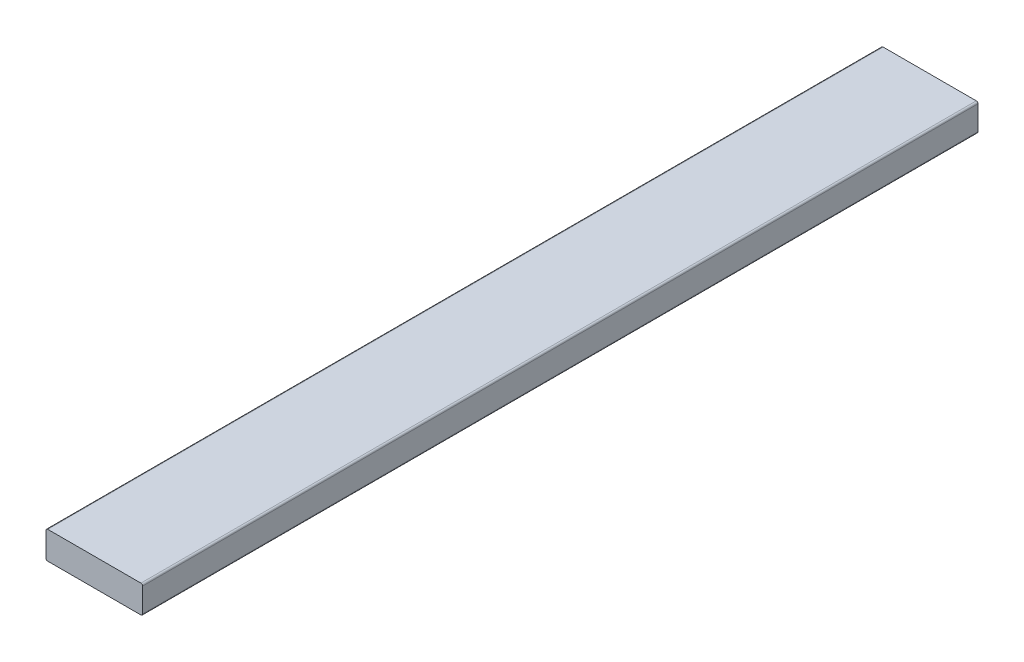
ISO-10303-21;
HEADER;
FILE_DESCRIPTION(('STEP AP214'),'2;1');
FILE_NAME('part.step','',(''),(''),'','','');
FILE_SCHEMA(('AUTOMOTIVE_DESIGN { 1 0 10303 214 1 1 1 1 }'));
ENDSEC;
DATA;
#1=APPLICATION_CONTEXT('core data for automotive mechanical design processes');
#2=APPLICATION_PROTOCOL_DEFINITION('international standard','automotive_design',2000,#1);
#3=PRODUCT_CONTEXT('',#1,'mechanical');
#4=PRODUCT('Part','Part','',(#3));
#5=PRODUCT_RELATED_PRODUCT_CATEGORY('part','',(#4));
#6=PRODUCT_DEFINITION_FORMATION('','',#4);
#7=PRODUCT_DEFINITION_CONTEXT('part definition',#1,'design');
#8=PRODUCT_DEFINITION('design','',#6,#7);
#9=PRODUCT_DEFINITION_SHAPE('','',#8);
#10=(LENGTH_UNIT() NAMED_UNIT(*) SI_UNIT(.MILLI.,.METRE.));
#11=(NAMED_UNIT(*) PLANE_ANGLE_UNIT() SI_UNIT($,.RADIAN.));
#12=(NAMED_UNIT(*) SI_UNIT($,.STERADIAN.) SOLID_ANGLE_UNIT());
#13=UNCERTAINTY_MEASURE_WITH_UNIT(LENGTH_MEASURE(1.E-05),#10,'distance_accuracy_value','');
#14=(GEOMETRIC_REPRESENTATION_CONTEXT(3) GLOBAL_UNCERTAINTY_ASSIGNED_CONTEXT((#13)) GLOBAL_UNIT_ASSIGNED_CONTEXT((#10,
#11,#12)) REPRESENTATION_CONTEXT('',''));
#15=CARTESIAN_POINT('',(0.,0.,0.));
#16=DIRECTION('',(0.,0.,1.));
#17=DIRECTION('',(1.,0.,0.));
#18=AXIS2_PLACEMENT_3D('',#15,#16,#17);
#19=CARTESIAN_POINT('',(44.45,-12.7,768.35));
#20=DIRECTION('',(-1.,0.,0.));
#21=DIRECTION('',(0.,0.,1.));
#22=AXIS2_PLACEMENT_3D('',#19,#20,#21);
#23=PLANE('',#22);
#24=DIRECTION('',(0.,1.,0.));
#25=VECTOR('',#24,1.);
#26=CARTESIAN_POINT('',(44.45,-12.7,768.35));
#27=LINE('',#26,#25);
#28=CARTESIAN_POINT('',(44.45,-11.1125,768.35));
#29=VERTEX_POINT('',#28);
#30=CARTESIAN_POINT('',(44.45,11.1125,768.35));
#31=VERTEX_POINT('',#30);
#32=EDGE_CURVE('E126',#29,#31,#27,.T.);
#33=ORIENTED_EDGE('',*,*,#32,.F.);
#34=DIRECTION('',(0.,0.,-1.));
#35=VECTOR('',#34,1.);
#36=CARTESIAN_POINT('',(44.45,-11.1125,768.35));
#37=LINE('',#36,#35);
#38=CARTESIAN_POINT('',(44.45,-11.1125,0.));
#39=VERTEX_POINT('',#38);
#40=EDGE_CURVE('E152',#29,#39,#37,.T.);
#41=ORIENTED_EDGE('',*,*,#40,.T.);
#42=DIRECTION('',(0.,1.,0.));
#43=VECTOR('',#42,1.);
#44=CARTESIAN_POINT('',(44.45,-12.7,0.));
#45=LINE('',#44,#43);
#46=CARTESIAN_POINT('',(44.45,11.1125,0.));
#47=VERTEX_POINT('',#46);
#48=EDGE_CURVE('E160',#39,#47,#45,.T.);
#49=ORIENTED_EDGE('',*,*,#48,.T.);
#50=DIRECTION('',(0.,0.,-1.));
#51=VECTOR('',#50,1.);
#52=CARTESIAN_POINT('',(44.45,11.1125,768.35));
#53=LINE('',#52,#51);
#54=EDGE_CURVE('E150',#47,#31,#53,.F.);
#55=ORIENTED_EDGE('',*,*,#54,.T.);
#56=EDGE_LOOP('',(#33,#41,#49,#55));
#57=FACE_BOUND('',#56,.T.);
#58=ADVANCED_FACE('F35',(#57),#23,.F.);
#59=CARTESIAN_POINT('',(-44.45,12.7,768.35));
#60=DIRECTION('',(0.,-1.,0.));
#61=DIRECTION('',(0.,0.,-1.));
#62=AXIS2_PLACEMENT_3D('',#59,#60,#61);
#63=PLANE('',#62);
#64=DIRECTION('',(-1.,0.,0.));
#65=VECTOR('',#64,1.);
#66=CARTESIAN_POINT('',(-44.45,12.7,0.));
#67=LINE('',#66,#65);
#68=CARTESIAN_POINT('',(42.8625,12.7,0.));
#69=VERTEX_POINT('',#68);
#70=CARTESIAN_POINT('',(-42.8625,12.7,0.));
#71=VERTEX_POINT('',#70);
#72=EDGE_CURVE('E131',#69,#71,#67,.T.);
#73=ORIENTED_EDGE('',*,*,#72,.T.);
#74=DIRECTION('',(0.,0.,-1.));
#75=VECTOR('',#74,1.);
#76=CARTESIAN_POINT('',(-42.8625,12.7,768.35));
#77=LINE('',#76,#75);
#78=CARTESIAN_POINT('',(-42.8625,12.7,768.35));
#79=VERTEX_POINT('',#78);
#80=EDGE_CURVE('E11',#71,#79,#77,.F.);
#81=ORIENTED_EDGE('',*,*,#80,.T.);
#82=DIRECTION('',(-1.,0.,0.));
#83=VECTOR('',#82,1.);
#84=CARTESIAN_POINT('',(-44.45,12.7,768.35));
#85=LINE('',#84,#83);
#86=CARTESIAN_POINT('',(42.8625,12.7,768.35));
#87=VERTEX_POINT('',#86);
#88=EDGE_CURVE('E129',#87,#79,#85,.T.);
#89=ORIENTED_EDGE('',*,*,#88,.F.);
#90=DIRECTION('',(0.,0.,-1.));
#91=VECTOR('',#90,1.);
#92=CARTESIAN_POINT('',(42.8625,12.7,768.35));
#93=LINE('',#92,#91);
#94=EDGE_CURVE('E43',#87,#69,#93,.T.);
#95=ORIENTED_EDGE('',*,*,#94,.T.);
#96=EDGE_LOOP('',(#73,#81,#89,#95));
#97=FACE_BOUND('',#96,.T.);
#98=ADVANCED_FACE('F157',(#97),#63,.F.);
#99=CARTESIAN_POINT('',(-44.45,-12.7,768.35));
#100=DIRECTION('',(1.,0.,0.));
#101=DIRECTION('',(0.,0.,-1.));
#102=AXIS2_PLACEMENT_3D('',#99,#100,#101);
#103=PLANE('',#102);
#104=DIRECTION('',(0.,-1.,0.));
#105=VECTOR('',#104,1.);
#106=CARTESIAN_POINT('',(-44.45,-12.7,0.));
#107=LINE('',#106,#105);
#108=CARTESIAN_POINT('',(-44.45,11.1125,0.));
#109=VERTEX_POINT('',#108);
#110=CARTESIAN_POINT('',(-44.45,-11.1125,0.));
#111=VERTEX_POINT('',#110);
#112=EDGE_CURVE('E127',#109,#111,#107,.T.);
#113=ORIENTED_EDGE('',*,*,#112,.T.);
#114=DIRECTION('',(0.,0.,-1.));
#115=VECTOR('',#114,1.);
#116=CARTESIAN_POINT('',(-44.45,-11.1125,768.35));
#117=LINE('',#116,#115);
#118=CARTESIAN_POINT('',(-44.45,-11.1125,768.35));
#119=VERTEX_POINT('',#118);
#120=EDGE_CURVE('E105',#111,#119,#117,.F.);
#121=ORIENTED_EDGE('',*,*,#120,.T.);
#122=DIRECTION('',(0.,-1.,0.));
#123=VECTOR('',#122,1.);
#124=CARTESIAN_POINT('',(-44.45,-12.7,768.35));
#125=LINE('',#124,#123);
#126=CARTESIAN_POINT('',(-44.45,11.1125,768.35));
#127=VERTEX_POINT('',#126);
#128=EDGE_CURVE('E164',#127,#119,#125,.T.);
#129=ORIENTED_EDGE('',*,*,#128,.F.);
#130=DIRECTION('',(0.,0.,-1.));
#131=VECTOR('',#130,1.);
#132=CARTESIAN_POINT('',(-44.45,11.1125,768.35));
#133=LINE('',#132,#131);
#134=EDGE_CURVE('E110',#127,#109,#133,.T.);
#135=ORIENTED_EDGE('',*,*,#134,.T.);
#136=EDGE_LOOP('',(#113,#121,#129,#135));
#137=FACE_BOUND('',#136,.T.);
#138=ADVANCED_FACE('F174',(#137),#103,.F.);
#139=CARTESIAN_POINT('',(-44.45,-12.7,768.35));
#140=DIRECTION('',(0.,1.,0.));
#141=DIRECTION('',(0.,0.,1.));
#142=AXIS2_PLACEMENT_3D('',#139,#140,#141);
#143=PLANE('',#142);
#144=DIRECTION('',(1.,0.,0.));
#145=VECTOR('',#144,1.);
#146=CARTESIAN_POINT('',(-44.45,-12.7,768.35));
#147=LINE('',#146,#145);
#148=CARTESIAN_POINT('',(-42.8625,-12.7,768.35));
#149=VERTEX_POINT('',#148);
#150=CARTESIAN_POINT('',(42.8625,-12.7,768.35));
#151=VERTEX_POINT('',#150);
#152=EDGE_CURVE('E120',#149,#151,#147,.T.);
#153=ORIENTED_EDGE('',*,*,#152,.F.);
#154=DIRECTION('',(0.,0.,-1.));
#155=VECTOR('',#154,1.);
#156=CARTESIAN_POINT('',(-42.8625,-12.7,768.35));
#157=LINE('',#156,#155);
#158=CARTESIAN_POINT('',(-42.8625,-12.7,0.));
#159=VERTEX_POINT('',#158);
#160=EDGE_CURVE('E104',#149,#159,#157,.T.);
#161=ORIENTED_EDGE('',*,*,#160,.T.);
#162=DIRECTION('',(1.,0.,0.));
#163=VECTOR('',#162,1.);
#164=CARTESIAN_POINT('',(-44.45,-12.7,0.));
#165=LINE('',#164,#163);
#166=CARTESIAN_POINT('',(42.8625,-12.7,0.));
#167=VERTEX_POINT('',#166);
#168=EDGE_CURVE('E117',#159,#167,#165,.T.);
#169=ORIENTED_EDGE('',*,*,#168,.T.);
#170=DIRECTION('',(0.,0.,-1.));
#171=VECTOR('',#170,1.);
#172=CARTESIAN_POINT('',(42.8625,-12.7,768.35));
#173=LINE('',#172,#171);
#174=EDGE_CURVE('E122',#167,#151,#173,.F.);
#175=ORIENTED_EDGE('',*,*,#174,.T.);
#176=EDGE_LOOP('',(#153,#161,#169,#175));
#177=FACE_BOUND('',#176,.T.);
#178=ADVANCED_FACE('F116',(#177),#143,.F.);
#179=CARTESIAN_POINT('',(0.,0.,768.35));
#180=DIRECTION('',(0.,0.,-1.));
#181=DIRECTION('',(-1.,0.,0.));
#182=AXIS2_PLACEMENT_3D('',#179,#180,#181);
#183=PLANE('',#182);
#184=ORIENTED_EDGE('',*,*,#128,.T.);
#185=CARTESIAN_POINT('',(-42.8625,-11.1125,768.35));
#186=DIRECTION('',(0.,0.,-1.));
#187=DIRECTION('',(-1.,0.,0.));
#188=AXIS2_PLACEMENT_3D('',#185,#186,#187);
#189=CIRCLE('',#188,1.5875);
#190=EDGE_CURVE('E148',#119,#149,#189,.F.);
#191=ORIENTED_EDGE('',*,*,#190,.T.);
#192=ORIENTED_EDGE('',*,*,#152,.T.);
#193=CARTESIAN_POINT('',(42.8625,-11.1125,768.35));
#194=DIRECTION('',(0.,0.,-1.));
#195=DIRECTION('',(-1.,0.,0.));
#196=AXIS2_PLACEMENT_3D('',#193,#194,#195);
#197=CIRCLE('',#196,1.5875);
#198=EDGE_CURVE('E146',#151,#29,#197,.F.);
#199=ORIENTED_EDGE('',*,*,#198,.T.);
#200=ORIENTED_EDGE('',*,*,#32,.T.);
#201=CARTESIAN_POINT('',(42.8625,11.1125,768.35));
#202=DIRECTION('',(0.,0.,-1.));
#203=DIRECTION('',(-1.,0.,0.));
#204=AXIS2_PLACEMENT_3D('',#201,#202,#203);
#205=CIRCLE('',#204,1.5875);
#206=EDGE_CURVE('E55',#31,#87,#205,.F.);
#207=ORIENTED_EDGE('',*,*,#206,.T.);
#208=ORIENTED_EDGE('',*,*,#88,.T.);
#209=CARTESIAN_POINT('',(-42.8625,11.1125,768.35));
#210=DIRECTION('',(0.,0.,-1.));
#211=DIRECTION('',(-1.,0.,0.));
#212=AXIS2_PLACEMENT_3D('',#209,#210,#211);
#213=CIRCLE('',#212,1.5875);
#214=EDGE_CURVE('E144',#79,#127,#213,.F.);
#215=ORIENTED_EDGE('',*,*,#214,.T.);
#216=EDGE_LOOP('',(#184,#191,#192,#199,#200,#207,#208,#215));
#217=FACE_BOUND('',#216,.T.);
#218=ADVANCED_FACE('F168',(#217),#183,.F.);
#219=CARTESIAN_POINT('',(0.,0.,0.));
#220=DIRECTION('',(0.,0.,-1.));
#221=DIRECTION('',(-1.,0.,0.));
#222=AXIS2_PLACEMENT_3D('',#219,#220,#221);
#223=PLANE('',#222);
#224=ORIENTED_EDGE('',*,*,#168,.F.);
#225=CARTESIAN_POINT('',(-42.8625,-11.1125,0.));
#226=DIRECTION('',(0.,0.,-1.));
#227=DIRECTION('',(-1.,0.,0.));
#228=AXIS2_PLACEMENT_3D('',#225,#226,#227);
#229=CIRCLE('',#228,1.5875);
#230=EDGE_CURVE('E100',#159,#111,#229,.T.);
#231=ORIENTED_EDGE('',*,*,#230,.T.);
#232=ORIENTED_EDGE('',*,*,#112,.F.);
#233=CARTESIAN_POINT('',(-42.8625,11.1125,0.));
#234=DIRECTION('',(0.,0.,-1.));
#235=DIRECTION('',(-1.,0.,0.));
#236=AXIS2_PLACEMENT_3D('',#233,#234,#235);
#237=CIRCLE('',#236,1.5875);
#238=EDGE_CURVE('E137',#109,#71,#237,.T.);
#239=ORIENTED_EDGE('',*,*,#238,.T.);
#240=ORIENTED_EDGE('',*,*,#72,.F.);
#241=CARTESIAN_POINT('',(42.8625,11.1125,0.));
#242=DIRECTION('',(0.,0.,-1.));
#243=DIRECTION('',(-1.,0.,0.));
#244=AXIS2_PLACEMENT_3D('',#241,#242,#243);
#245=CIRCLE('',#244,1.5875);
#246=EDGE_CURVE('E121',#69,#47,#245,.T.);
#247=ORIENTED_EDGE('',*,*,#246,.T.);
#248=ORIENTED_EDGE('',*,*,#48,.F.);
#249=CARTESIAN_POINT('',(42.8625,-11.1125,0.));
#250=DIRECTION('',(0.,0.,-1.));
#251=DIRECTION('',(-1.,0.,0.));
#252=AXIS2_PLACEMENT_3D('',#249,#250,#251);
#253=CIRCLE('',#252,1.5875);
#254=EDGE_CURVE('E111',#39,#167,#253,.T.);
#255=ORIENTED_EDGE('',*,*,#254,.T.);
#256=EDGE_LOOP('',(#224,#231,#232,#239,#240,#247,#248,#255));
#257=FACE_BOUND('',#256,.T.);
#258=ADVANCED_FACE('F124',(#257),#223,.T.);
#259=CARTESIAN_POINT('',(-42.8625,-11.1125,768.35));
#260=DIRECTION('',(0.,0.,-1.));
#261=DIRECTION('',(-1.,0.,0.));
#262=AXIS2_PLACEMENT_3D('',#259,#260,#261);
#263=CYLINDRICAL_SURFACE('',#262,1.5875);
#264=ORIENTED_EDGE('',*,*,#190,.F.);
#265=ORIENTED_EDGE('',*,*,#120,.F.);
#266=ORIENTED_EDGE('',*,*,#230,.F.);
#267=ORIENTED_EDGE('',*,*,#160,.F.);
#268=EDGE_LOOP('',(#264,#265,#266,#267));
#269=FACE_BOUND('',#268,.T.);
#270=ADVANCED_FACE('F103',(#269),#263,.T.);
#271=CARTESIAN_POINT('',(42.8625,-11.1125,768.35));
#272=DIRECTION('',(0.,0.,-1.));
#273=DIRECTION('',(-1.,0.,0.));
#274=AXIS2_PLACEMENT_3D('',#271,#272,#273);
#275=CYLINDRICAL_SURFACE('',#274,1.5875);
#276=ORIENTED_EDGE('',*,*,#198,.F.);
#277=ORIENTED_EDGE('',*,*,#174,.F.);
#278=ORIENTED_EDGE('',*,*,#254,.F.);
#279=ORIENTED_EDGE('',*,*,#40,.F.);
#280=EDGE_LOOP('',(#276,#277,#278,#279));
#281=FACE_BOUND('',#280,.T.);
#282=ADVANCED_FACE('F179',(#281),#275,.T.);
#283=CARTESIAN_POINT('',(-42.8625,11.1125,768.35));
#284=DIRECTION('',(0.,0.,-1.));
#285=DIRECTION('',(-1.,0.,0.));
#286=AXIS2_PLACEMENT_3D('',#283,#284,#285);
#287=CYLINDRICAL_SURFACE('',#286,1.5875);
#288=ORIENTED_EDGE('',*,*,#214,.F.);
#289=ORIENTED_EDGE('',*,*,#80,.F.);
#290=ORIENTED_EDGE('',*,*,#238,.F.);
#291=ORIENTED_EDGE('',*,*,#134,.F.);
#292=EDGE_LOOP('',(#288,#289,#290,#291));
#293=FACE_BOUND('',#292,.T.);
#294=ADVANCED_FACE('F172',(#293),#287,.T.);
#295=CARTESIAN_POINT('',(42.8625,11.1125,768.35));
#296=DIRECTION('',(0.,0.,-1.));
#297=DIRECTION('',(-1.,0.,0.));
#298=AXIS2_PLACEMENT_3D('',#295,#296,#297);
#299=CYLINDRICAL_SURFACE('',#298,1.5875);
#300=ORIENTED_EDGE('',*,*,#206,.F.);
#301=ORIENTED_EDGE('',*,*,#54,.F.);
#302=ORIENTED_EDGE('',*,*,#246,.F.);
#303=ORIENTED_EDGE('',*,*,#94,.F.);
#304=EDGE_LOOP('',(#300,#301,#302,#303));
#305=FACE_BOUND('',#304,.T.);
#306=ADVANCED_FACE('F37',(#305),#299,.T.);
#307=CLOSED_SHELL('',(#58,#98,#138,#178,#218,#258,#270,#282,#294,#306));
#308=MANIFOLD_SOLID_BREP('B2',#307);
#309=ADVANCED_BREP_SHAPE_REPRESENTATION('',(#18,#308),#14);
#310=SHAPE_DEFINITION_REPRESENTATION(#9,#309);
ENDSEC;
END-ISO-10303-21;
